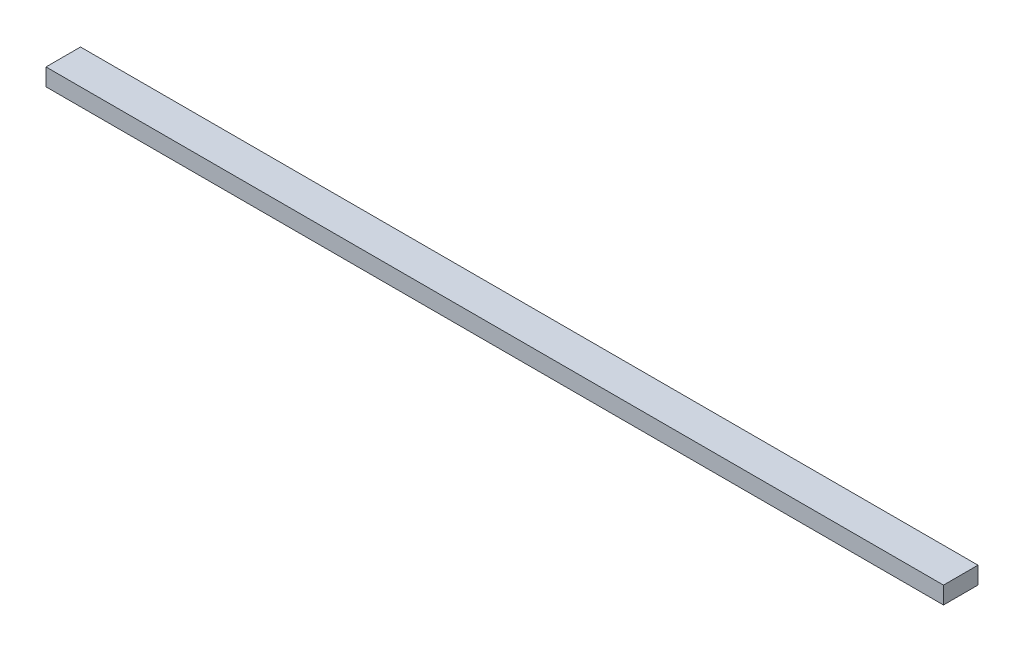
ISO-10303-21;
HEADER;
FILE_DESCRIPTION(('STEP AP214'),'2;1');
FILE_NAME('part.step','',(''),(''),'','','');
FILE_SCHEMA(('AUTOMOTIVE_DESIGN { 1 0 10303 214 1 1 1 1 }'));
ENDSEC;
DATA;
#1=APPLICATION_CONTEXT('core data for automotive mechanical design processes');
#2=APPLICATION_PROTOCOL_DEFINITION('international standard','automotive_design',2000,#1);
#3=PRODUCT_CONTEXT('',#1,'mechanical');
#4=PRODUCT('Part','Part','',(#3));
#5=PRODUCT_RELATED_PRODUCT_CATEGORY('part','',(#4));
#6=PRODUCT_DEFINITION_FORMATION('','',#4);
#7=PRODUCT_DEFINITION_CONTEXT('part definition',#1,'design');
#8=PRODUCT_DEFINITION('design','',#6,#7);
#9=PRODUCT_DEFINITION_SHAPE('','',#8);
#10=(LENGTH_UNIT() NAMED_UNIT(*) SI_UNIT(.MILLI.,.METRE.));
#11=(NAMED_UNIT(*) PLANE_ANGLE_UNIT() SI_UNIT($,.RADIAN.));
#12=(NAMED_UNIT(*) SI_UNIT($,.STERADIAN.) SOLID_ANGLE_UNIT());
#13=UNCERTAINTY_MEASURE_WITH_UNIT(LENGTH_MEASURE(1.E-05),#10,'distance_accuracy_value','');
#14=(GEOMETRIC_REPRESENTATION_CONTEXT(3) GLOBAL_UNCERTAINTY_ASSIGNED_CONTEXT((#13)) GLOBAL_UNIT_ASSIGNED_CONTEXT((#10,
#11,#12)) REPRESENTATION_CONTEXT('',''));
#15=CARTESIAN_POINT('',(0.,0.,0.));
#16=DIRECTION('',(0.,0.,1.));
#17=DIRECTION('',(1.,0.,0.));
#18=AXIS2_PLACEMENT_3D('',#15,#16,#17);
#19=CARTESIAN_POINT('',(169.095883596566,25.,49.9999999999998));
#20=DIRECTION('',(0.,0.,1.));
#21=DIRECTION('',(1.,0.,0.));
#22=AXIS2_PLACEMENT_3D('',#19,#20,#21);
#23=PLANE('',#22);
#24=DIRECTION('',(-1.,0.,0.));
#25=VECTOR('',#24,1.);
#26=CARTESIAN_POINT('',(169.095883596566,0.,49.9999999999998));
#27=LINE('',#26,#25);
#28=CARTESIAN_POINT('',(169.095883596566,0.,49.9999999999998));
#29=VERTEX_POINT('',#28);
#30=CARTESIAN_POINT('',(-1130.90411640343,0.,50.));
#31=VERTEX_POINT('',#30);
#32=EDGE_CURVE('E107',#29,#31,#27,.T.);
#33=ORIENTED_EDGE('',*,*,#32,.T.);
#34=DIRECTION('',(0.,-1.,0.));
#35=VECTOR('',#34,1.);
#36=CARTESIAN_POINT('',(-1130.90411640343,25.,50.));
#37=LINE('',#36,#35);
#38=CARTESIAN_POINT('',(-1130.90411640343,25.,50.));
#39=VERTEX_POINT('',#38);
#40=EDGE_CURVE('E11',#39,#31,#37,.T.);
#41=ORIENTED_EDGE('',*,*,#40,.F.);
#42=DIRECTION('',(-1.,0.,0.));
#43=VECTOR('',#42,1.);
#44=CARTESIAN_POINT('',(169.095883596566,25.,49.9999999999998));
#45=LINE('',#44,#43);
#46=CARTESIAN_POINT('',(169.095883596566,25.,49.9999999999998));
#47=VERTEX_POINT('',#46);
#48=EDGE_CURVE('E91',#47,#39,#45,.T.);
#49=ORIENTED_EDGE('',*,*,#48,.F.);
#50=DIRECTION('',(0.,-1.,0.));
#51=VECTOR('',#50,1.);
#52=CARTESIAN_POINT('',(169.095883596566,25.,49.9999999999998));
#53=LINE('',#52,#51);
#54=EDGE_CURVE('E103',#47,#29,#53,.T.);
#55=ORIENTED_EDGE('',*,*,#54,.T.);
#56=EDGE_LOOP('',(#33,#41,#49,#55));
#57=FACE_BOUND('',#56,.T.);
#58=ADVANCED_FACE('F39',(#57),#23,.F.);
#59=CARTESIAN_POINT('',(-1130.90411640343,25.,50.));
#60=DIRECTION('',(1.,0.,0.));
#61=DIRECTION('',(0.,0.,-1.));
#62=AXIS2_PLACEMENT_3D('',#59,#60,#61);
#63=PLANE('',#62);
#64=DIRECTION('',(0.,0.,1.));
#65=VECTOR('',#64,1.);
#66=CARTESIAN_POINT('',(-1130.90411640343,0.,50.));
#67=LINE('',#66,#65);
#68=CARTESIAN_POINT('',(-1130.90411640343,0.,100.));
#69=VERTEX_POINT('',#68);
#70=EDGE_CURVE('E96',#31,#69,#67,.T.);
#71=ORIENTED_EDGE('',*,*,#70,.T.);
#72=DIRECTION('',(0.,-1.,0.));
#73=VECTOR('',#72,1.);
#74=CARTESIAN_POINT('',(-1130.90411640343,25.,100.));
#75=LINE('',#74,#73);
#76=CARTESIAN_POINT('',(-1130.90411640343,25.,100.));
#77=VERTEX_POINT('',#76);
#78=EDGE_CURVE('E48',#77,#69,#75,.T.);
#79=ORIENTED_EDGE('',*,*,#78,.F.);
#80=DIRECTION('',(0.,0.,1.));
#81=VECTOR('',#80,1.);
#82=CARTESIAN_POINT('',(-1130.90411640343,25.,50.));
#83=LINE('',#82,#81);
#84=EDGE_CURVE('E86',#39,#77,#83,.T.);
#85=ORIENTED_EDGE('',*,*,#84,.F.);
#86=ORIENTED_EDGE('',*,*,#40,.T.);
#87=EDGE_LOOP('',(#71,#79,#85,#86));
#88=FACE_BOUND('',#87,.T.);
#89=ADVANCED_FACE('F95',(#88),#63,.F.);
#90=CARTESIAN_POINT('',(-1130.90411640343,25.,100.));
#91=DIRECTION('',(0.,0.,-1.));
#92=DIRECTION('',(-1.,0.,0.));
#93=AXIS2_PLACEMENT_3D('',#90,#91,#92);
#94=PLANE('',#93);
#95=DIRECTION('',(1.,0.,0.));
#96=VECTOR('',#95,1.);
#97=CARTESIAN_POINT('',(-1130.90411640343,0.,100.));
#98=LINE('',#97,#96);
#99=CARTESIAN_POINT('',(169.095883596566,0.,100.));
#100=VERTEX_POINT('',#99);
#101=EDGE_CURVE('E73',#69,#100,#98,.T.);
#102=ORIENTED_EDGE('',*,*,#101,.T.);
#103=DIRECTION('',(0.,-1.,0.));
#104=VECTOR('',#103,1.);
#105=CARTESIAN_POINT('',(169.095883596566,25.,100.));
#106=LINE('',#105,#104);
#107=CARTESIAN_POINT('',(169.095883596566,25.,100.));
#108=VERTEX_POINT('',#107);
#109=EDGE_CURVE('E98',#108,#100,#106,.T.);
#110=ORIENTED_EDGE('',*,*,#109,.F.);
#111=DIRECTION('',(1.,0.,0.));
#112=VECTOR('',#111,1.);
#113=CARTESIAN_POINT('',(-1130.90411640343,25.,100.));
#114=LINE('',#113,#112);
#115=EDGE_CURVE('E89',#77,#108,#114,.T.);
#116=ORIENTED_EDGE('',*,*,#115,.F.);
#117=ORIENTED_EDGE('',*,*,#78,.T.);
#118=EDGE_LOOP('',(#102,#110,#116,#117));
#119=FACE_BOUND('',#118,.T.);
#120=ADVANCED_FACE('F99',(#119),#94,.F.);
#121=CARTESIAN_POINT('',(169.095883596566,25.,100.));
#122=DIRECTION('',(-1.,0.,0.));
#123=DIRECTION('',(0.,0.,1.));
#124=AXIS2_PLACEMENT_3D('',#121,#122,#123);
#125=PLANE('',#124);
#126=DIRECTION('',(0.,0.,-1.));
#127=VECTOR('',#126,1.);
#128=CARTESIAN_POINT('',(169.095883596566,0.,100.));
#129=LINE('',#128,#127);
#130=EDGE_CURVE('E79',#100,#29,#129,.T.);
#131=ORIENTED_EDGE('',*,*,#130,.T.);
#132=ORIENTED_EDGE('',*,*,#54,.F.);
#133=DIRECTION('',(0.,0.,-1.));
#134=VECTOR('',#133,1.);
#135=CARTESIAN_POINT('',(169.095883596566,25.,100.));
#136=LINE('',#135,#134);
#137=EDGE_CURVE('E56',#108,#47,#136,.T.);
#138=ORIENTED_EDGE('',*,*,#137,.F.);
#139=ORIENTED_EDGE('',*,*,#109,.T.);
#140=EDGE_LOOP('',(#131,#132,#138,#139));
#141=FACE_BOUND('',#140,.T.);
#142=ADVANCED_FACE('F120',(#141),#125,.F.);
#143=CARTESIAN_POINT('',(0.,25.,0.));
#144=DIRECTION('',(0.,1.,0.));
#145=DIRECTION('',(0.,0.,1.));
#146=AXIS2_PLACEMENT_3D('',#143,#144,#145);
#147=PLANE('',#146);
#148=ORIENTED_EDGE('',*,*,#48,.T.);
#149=ORIENTED_EDGE('',*,*,#84,.T.);
#150=ORIENTED_EDGE('',*,*,#115,.T.);
#151=ORIENTED_EDGE('',*,*,#137,.T.);
#152=EDGE_LOOP('',(#148,#149,#150,#151));
#153=FACE_BOUND('',#152,.T.);
#154=ADVANCED_FACE('F87',(#153),#147,.T.);
#155=CARTESIAN_POINT('',(0.,0.,0.));
#156=DIRECTION('',(0.,1.,0.));
#157=DIRECTION('',(0.,0.,1.));
#158=AXIS2_PLACEMENT_3D('',#155,#156,#157);
#159=PLANE('',#158);
#160=ORIENTED_EDGE('',*,*,#32,.F.);
#161=ORIENTED_EDGE('',*,*,#130,.F.);
#162=ORIENTED_EDGE('',*,*,#101,.F.);
#163=ORIENTED_EDGE('',*,*,#70,.F.);
#164=EDGE_LOOP('',(#160,#161,#162,#163));
#165=FACE_BOUND('',#164,.T.);
#166=ADVANCED_FACE('F123',(#165),#159,.F.);
#167=CLOSED_SHELL('',(#58,#89,#120,#142,#154,#166));
#168=MANIFOLD_SOLID_BREP('B2',#167);
#169=ADVANCED_BREP_SHAPE_REPRESENTATION('',(#18,#168),#14);
#170=SHAPE_DEFINITION_REPRESENTATION(#9,#169);
ENDSEC;
END-ISO-10303-21;
